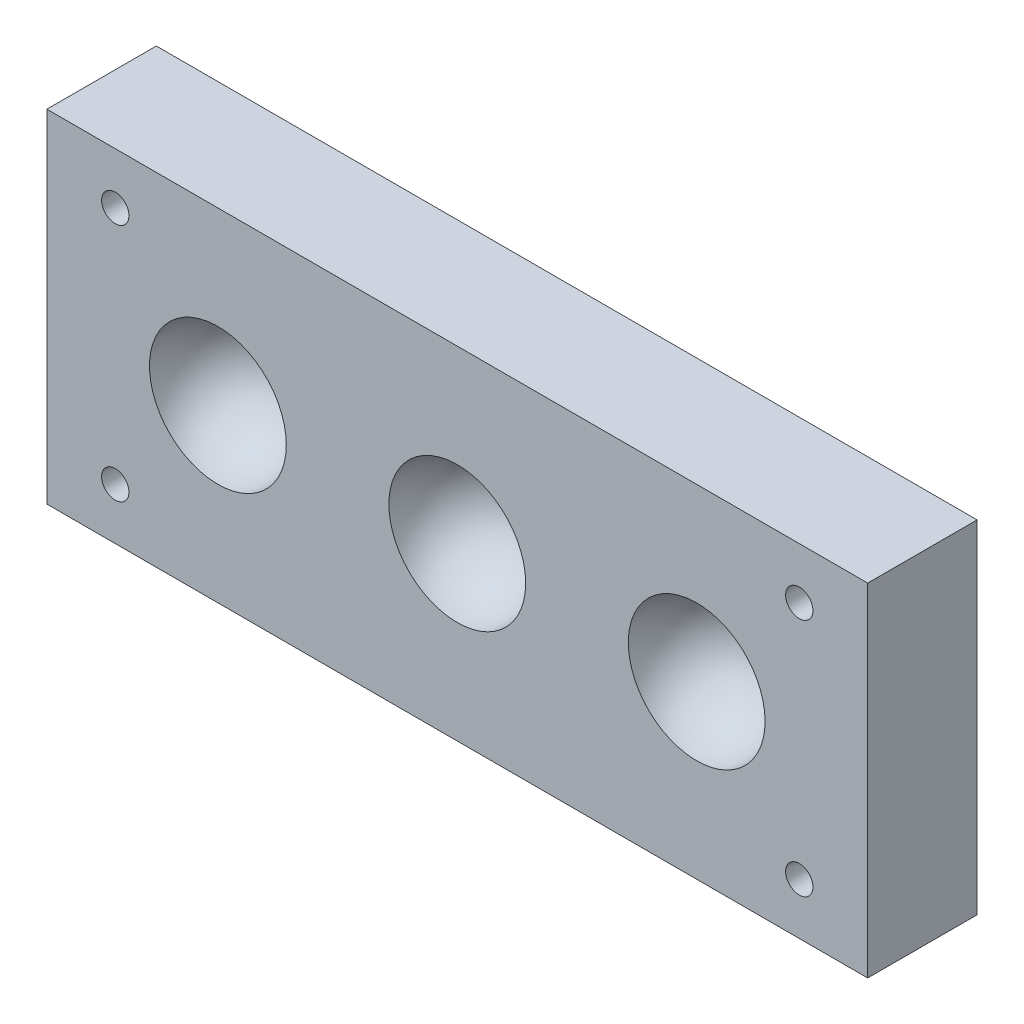
ISO-10303-21;
HEADER;
FILE_DESCRIPTION(('STEP AP214'),'2;1');
FILE_NAME('part.step','',(''),(''),'','','');
FILE_SCHEMA(('AUTOMOTIVE_DESIGN { 1 0 10303 214 1 1 1 1 }'));
ENDSEC;
DATA;
#1=APPLICATION_CONTEXT('core data for automotive mechanical design processes');
#2=APPLICATION_PROTOCOL_DEFINITION('international standard','automotive_design',2000,#1);
#3=PRODUCT_CONTEXT('',#1,'mechanical');
#4=PRODUCT('Part','Part','',(#3));
#5=PRODUCT_RELATED_PRODUCT_CATEGORY('part','',(#4));
#6=PRODUCT_DEFINITION_FORMATION('','',#4);
#7=PRODUCT_DEFINITION_CONTEXT('part definition',#1,'design');
#8=PRODUCT_DEFINITION('design','',#6,#7);
#9=PRODUCT_DEFINITION_SHAPE('','',#8);
#10=(LENGTH_UNIT() NAMED_UNIT(*) SI_UNIT(.MILLI.,.METRE.));
#11=(NAMED_UNIT(*) PLANE_ANGLE_UNIT() SI_UNIT($,.RADIAN.));
#12=(NAMED_UNIT(*) SI_UNIT($,.STERADIAN.) SOLID_ANGLE_UNIT());
#13=UNCERTAINTY_MEASURE_WITH_UNIT(LENGTH_MEASURE(1.E-05),#10,'distance_accuracy_value','');
#14=(GEOMETRIC_REPRESENTATION_CONTEXT(3) GLOBAL_UNCERTAINTY_ASSIGNED_CONTEXT((#13)) GLOBAL_UNIT_ASSIGNED_CONTEXT((#10,
#11,#12)) REPRESENTATION_CONTEXT('',''));
#15=CARTESIAN_POINT('',(0.,0.,0.));
#16=DIRECTION('',(0.,0.,1.));
#17=DIRECTION('',(1.,0.,0.));
#18=AXIS2_PLACEMENT_3D('',#15,#16,#17);
#19=CARTESIAN_POINT('',(35.,0.,0.));
#20=DIRECTION('',(1.,0.,0.));
#21=DIRECTION('',(0.,1.,0.));
#22=AXIS2_PLACEMENT_3D('',#19,#20,#21);
#23=SPHERICAL_SURFACE('',#22,10.);
#24=CARTESIAN_POINT('',(35.,0.,0.));
#25=DIRECTION('',(0.,0.,1.));
#26=DIRECTION('',(1.,0.,0.));
#27=AXIS2_PLACEMENT_3D('',#24,#25,#26);
#28=SPHERICAL_SURFACE('',#27,10.);
#29=CARTESIAN_POINT('',(35.,0.,0.));
#30=DIRECTION('',(0.,0.,1.));
#31=DIRECTION('',(1.,0.,0.));
#32=AXIS2_PLACEMENT_3D('',#29,#30,#31);
#33=CIRCLE('',#32,10.);
#34=CARTESIAN_POINT('',(45.,0.,0.));
#35=VERTEX_POINT('',#34);
#36=EDGE_CURVE('E178',#35,#35,#33,.T.);
#37=ORIENTED_EDGE('',*,*,#36,.T.);
#38=EDGE_LOOP('',(#37));
#39=FACE_BOUND('',#38,.T.);
#40=ADVANCED_FACE('F16',(#39),#28,.F.);
#41=CARTESIAN_POINT('',(0.,0.,0.));
#42=DIRECTION('',(1.,0.,0.));
#43=DIRECTION('',(0.,1.,0.));
#44=AXIS2_PLACEMENT_3D('',#41,#42,#43);
#45=SPHERICAL_SURFACE('',#44,10.);
#46=CARTESIAN_POINT('',(0.,0.,0.));
#47=DIRECTION('',(0.,0.,1.));
#48=DIRECTION('',(1.,0.,0.));
#49=AXIS2_PLACEMENT_3D('',#46,#47,#48);
#50=SPHERICAL_SURFACE('',#49,10.);
#51=CARTESIAN_POINT('',(0.,0.,0.));
#52=DIRECTION('',(0.,0.,1.));
#53=DIRECTION('',(1.,0.,0.));
#54=AXIS2_PLACEMENT_3D('',#51,#52,#53);
#55=CIRCLE('',#54,10.);
#56=CARTESIAN_POINT('',(10.,0.,0.));
#57=VERTEX_POINT('',#56);
#58=EDGE_CURVE('E181',#57,#57,#55,.T.);
#59=ORIENTED_EDGE('',*,*,#58,.T.);
#60=EDGE_LOOP('',(#59));
#61=FACE_BOUND('',#60,.T.);
#62=ADVANCED_FACE('F302',(#61),#50,.F.);
#63=CARTESIAN_POINT('',(-35.,0.,0.));
#64=DIRECTION('',(1.,0.,0.));
#65=DIRECTION('',(0.,1.,0.));
#66=AXIS2_PLACEMENT_3D('',#63,#64,#65);
#67=SPHERICAL_SURFACE('',#66,10.);
#68=CARTESIAN_POINT('',(-35.,0.,0.));
#69=DIRECTION('',(0.,0.,1.));
#70=DIRECTION('',(1.,0.,0.));
#71=AXIS2_PLACEMENT_3D('',#68,#69,#70);
#72=SPHERICAL_SURFACE('',#71,10.);
#73=CARTESIAN_POINT('',(-35.,0.,0.));
#74=DIRECTION('',(0.,0.,1.));
#75=DIRECTION('',(1.,0.,0.));
#76=AXIS2_PLACEMENT_3D('',#73,#74,#75);
#77=CIRCLE('',#76,10.);
#78=CARTESIAN_POINT('',(-25.,0.,0.));
#79=VERTEX_POINT('',#78);
#80=EDGE_CURVE('E184',#79,#79,#77,.T.);
#81=ORIENTED_EDGE('',*,*,#80,.T.);
#82=EDGE_LOOP('',(#81));
#83=FACE_BOUND('',#82,.T.);
#84=ADVANCED_FACE('F287',(#83),#72,.F.);
#85=CARTESIAN_POINT('',(50.,17.5,-38.0953181031254));
#86=DIRECTION('',(0.,0.,1.));
#87=DIRECTION('',(1.,0.,0.));
#88=AXIS2_PLACEMENT_3D('',#85,#86,#87);
#89=CYLINDRICAL_SURFACE('',#88,2.);
#90=CARTESIAN_POINT('',(50.,17.5,-16.));
#91=DIRECTION('',(0.,0.,-1.));
#92=DIRECTION('',(1.,0.,0.));
#93=AXIS2_PLACEMENT_3D('',#90,#91,#92);
#94=CIRCLE('',#93,2.);
#95=CARTESIAN_POINT('',(52.,17.5,-16.));
#96=VERTEX_POINT('',#95);
#97=EDGE_CURVE('E147',#96,#96,#94,.T.);
#98=ORIENTED_EDGE('',*,*,#97,.T.);
#99=EDGE_LOOP('',(#98));
#100=FACE_BOUND('',#99,.T.);
#101=CARTESIAN_POINT('',(50.,17.5,0.));
#102=DIRECTION('',(0.,0.,-1.));
#103=DIRECTION('',(1.,0.,0.));
#104=AXIS2_PLACEMENT_3D('',#101,#102,#103);
#105=CIRCLE('',#104,2.);
#106=CARTESIAN_POINT('',(52.,17.5,0.));
#107=VERTEX_POINT('',#106);
#108=EDGE_CURVE('E187',#107,#107,#105,.T.);
#109=ORIENTED_EDGE('',*,*,#108,.F.);
#110=EDGE_LOOP('',(#109));
#111=FACE_BOUND('',#110,.T.);
#112=ADVANCED_FACE('F283',(#100,#111),#89,.F.);
#113=CARTESIAN_POINT('',(50.,-17.5,-38.0953181031254));
#114=DIRECTION('',(0.,0.,1.));
#115=DIRECTION('',(1.,0.,0.));
#116=AXIS2_PLACEMENT_3D('',#113,#114,#115);
#117=CYLINDRICAL_SURFACE('',#116,2.);
#118=CARTESIAN_POINT('',(50.,-17.5,-16.));
#119=DIRECTION('',(0.,0.,-1.));
#120=DIRECTION('',(1.,0.,0.));
#121=AXIS2_PLACEMENT_3D('',#118,#119,#120);
#122=CIRCLE('',#121,2.);
#123=CARTESIAN_POINT('',(52.,-17.5,-16.));
#124=VERTEX_POINT('',#123);
#125=EDGE_CURVE('E169',#124,#124,#122,.T.);
#126=ORIENTED_EDGE('',*,*,#125,.T.);
#127=EDGE_LOOP('',(#126));
#128=FACE_BOUND('',#127,.T.);
#129=CARTESIAN_POINT('',(50.,-17.5,0.));
#130=DIRECTION('',(0.,0.,-1.));
#131=DIRECTION('',(1.,0.,0.));
#132=AXIS2_PLACEMENT_3D('',#129,#130,#131);
#133=CIRCLE('',#132,2.);
#134=CARTESIAN_POINT('',(52.,-17.5,0.));
#135=VERTEX_POINT('',#134);
#136=EDGE_CURVE('E190',#135,#135,#133,.T.);
#137=ORIENTED_EDGE('',*,*,#136,.F.);
#138=EDGE_LOOP('',(#137));
#139=FACE_BOUND('',#138,.T.);
#140=ADVANCED_FACE('F286',(#128,#139),#117,.F.);
#141=CARTESIAN_POINT('',(-50.,17.5,-38.0953181031254));
#142=DIRECTION('',(0.,0.,1.));
#143=DIRECTION('',(1.,0.,0.));
#144=AXIS2_PLACEMENT_3D('',#141,#142,#143);
#145=CYLINDRICAL_SURFACE('',#144,2.);
#146=CARTESIAN_POINT('',(-50.,17.5,-16.));
#147=DIRECTION('',(0.,0.,-1.));
#148=DIRECTION('',(1.,0.,0.));
#149=AXIS2_PLACEMENT_3D('',#146,#147,#148);
#150=CIRCLE('',#149,2.);
#151=CARTESIAN_POINT('',(-48.,17.5,-16.));
#152=VERTEX_POINT('',#151);
#153=EDGE_CURVE('E172',#152,#152,#150,.T.);
#154=ORIENTED_EDGE('',*,*,#153,.T.);
#155=EDGE_LOOP('',(#154));
#156=FACE_BOUND('',#155,.T.);
#157=CARTESIAN_POINT('',(-50.,17.5,0.));
#158=DIRECTION('',(0.,0.,-1.));
#159=DIRECTION('',(1.,0.,0.));
#160=AXIS2_PLACEMENT_3D('',#157,#158,#159);
#161=CIRCLE('',#160,2.);
#162=CARTESIAN_POINT('',(-48.,17.5,0.));
#163=VERTEX_POINT('',#162);
#164=EDGE_CURVE('E24',#163,#163,#161,.T.);
#165=ORIENTED_EDGE('',*,*,#164,.F.);
#166=EDGE_LOOP('',(#165));
#167=FACE_BOUND('',#166,.T.);
#168=ADVANCED_FACE('F319',(#156,#167),#145,.F.);
#169=CARTESIAN_POINT('',(-50.,-17.5,-38.0953181031254));
#170=DIRECTION('',(0.,0.,1.));
#171=DIRECTION('',(1.,0.,0.));
#172=AXIS2_PLACEMENT_3D('',#169,#170,#171);
#173=CYLINDRICAL_SURFACE('',#172,2.);
#174=CARTESIAN_POINT('',(-50.,-17.5,-16.));
#175=DIRECTION('',(0.,0.,-1.));
#176=DIRECTION('',(1.,0.,0.));
#177=AXIS2_PLACEMENT_3D('',#174,#175,#176);
#178=CIRCLE('',#177,2.);
#179=CARTESIAN_POINT('',(-48.,-17.5,-16.));
#180=VERTEX_POINT('',#179);
#181=EDGE_CURVE('E175',#180,#180,#178,.T.);
#182=ORIENTED_EDGE('',*,*,#181,.T.);
#183=EDGE_LOOP('',(#182));
#184=FACE_BOUND('',#183,.T.);
#185=CARTESIAN_POINT('',(-50.,-17.5,0.));
#186=DIRECTION('',(0.,0.,-1.));
#187=DIRECTION('',(1.,0.,0.));
#188=AXIS2_PLACEMENT_3D('',#185,#186,#187);
#189=CIRCLE('',#188,2.);
#190=CARTESIAN_POINT('',(-48.,-17.5,0.));
#191=VERTEX_POINT('',#190);
#192=EDGE_CURVE('E10',#191,#191,#189,.T.);
#193=ORIENTED_EDGE('',*,*,#192,.F.);
#194=EDGE_LOOP('',(#193));
#195=FACE_BOUND('',#194,.T.);
#196=ADVANCED_FACE('F293',(#184,#195),#173,.F.);
#197=CARTESIAN_POINT('',(0.,0.,0.));
#198=DIRECTION('',(0.,0.,1.));
#199=DIRECTION('',(1.,0.,0.));
#200=AXIS2_PLACEMENT_3D('',#197,#198,#199);
#201=PLANE('',#200);
#202=DIRECTION('',(1.,0.,0.));
#203=VECTOR('',#202,1.);
#204=CARTESIAN_POINT('',(-60.,-25.,0.));
#205=LINE('',#204,#203);
#206=CARTESIAN_POINT('',(-60.,-25.,0.));
#207=VERTEX_POINT('',#206);
#208=CARTESIAN_POINT('',(60.,-25.,0.));
#209=VERTEX_POINT('',#208);
#210=EDGE_CURVE('E115',#207,#209,#205,.T.);
#211=ORIENTED_EDGE('',*,*,#210,.T.);
#212=DIRECTION('',(0.,1.,0.));
#213=VECTOR('',#212,1.);
#214=CARTESIAN_POINT('',(60.,-25.,0.));
#215=LINE('',#214,#213);
#216=CARTESIAN_POINT('',(60.,25.,0.));
#217=VERTEX_POINT('',#216);
#218=EDGE_CURVE('E155',#209,#217,#215,.T.);
#219=ORIENTED_EDGE('',*,*,#218,.T.);
#220=DIRECTION('',(-1.,0.,0.));
#221=VECTOR('',#220,1.);
#222=CARTESIAN_POINT('',(60.,25.,0.));
#223=LINE('',#222,#221);
#224=CARTESIAN_POINT('',(-60.,25.,0.));
#225=VERTEX_POINT('',#224);
#226=EDGE_CURVE('E116',#217,#225,#223,.T.);
#227=ORIENTED_EDGE('',*,*,#226,.T.);
#228=DIRECTION('',(0.,-1.,0.));
#229=VECTOR('',#228,1.);
#230=CARTESIAN_POINT('',(-60.,25.,0.));
#231=LINE('',#230,#229);
#232=EDGE_CURVE('E110',#225,#207,#231,.T.);
#233=ORIENTED_EDGE('',*,*,#232,.T.);
#234=EDGE_LOOP('',(#211,#219,#227,#233));
#235=FACE_BOUND('',#234,.T.);
#236=ORIENTED_EDGE('',*,*,#192,.T.);
#237=EDGE_LOOP('',(#236));
#238=FACE_BOUND('',#237,.T.);
#239=ORIENTED_EDGE('',*,*,#164,.T.);
#240=EDGE_LOOP('',(#239));
#241=FACE_BOUND('',#240,.T.);
#242=ORIENTED_EDGE('',*,*,#136,.T.);
#243=EDGE_LOOP('',(#242));
#244=FACE_BOUND('',#243,.T.);
#245=ORIENTED_EDGE('',*,*,#108,.T.);
#246=EDGE_LOOP('',(#245));
#247=FACE_BOUND('',#246,.T.);
#248=ORIENTED_EDGE('',*,*,#80,.F.);
#249=EDGE_LOOP('',(#248));
#250=FACE_BOUND('',#249,.T.);
#251=ORIENTED_EDGE('',*,*,#58,.F.);
#252=EDGE_LOOP('',(#251));
#253=FACE_BOUND('',#252,.T.);
#254=ORIENTED_EDGE('',*,*,#36,.F.);
#255=EDGE_LOOP('',(#254));
#256=FACE_BOUND('',#255,.T.);
#257=ADVANCED_FACE('F112',(#235,#238,#241,#244,#247,#250,#253,#256),#201,.T.);
#258=CARTESIAN_POINT('',(0.,0.,-16.));
#259=DIRECTION('',(0.,0.,1.));
#260=DIRECTION('',(1.,0.,0.));
#261=AXIS2_PLACEMENT_3D('',#258,#259,#260);
#262=PLANE('',#261);
#263=DIRECTION('',(1.,0.,0.));
#264=VECTOR('',#263,1.);
#265=CARTESIAN_POINT('',(-60.,-25.,-16.));
#266=LINE('',#265,#264);
#267=CARTESIAN_POINT('',(-60.,-25.,-16.));
#268=VERTEX_POINT('',#267);
#269=CARTESIAN_POINT('',(60.,-25.,-16.));
#270=VERTEX_POINT('',#269);
#271=EDGE_CURVE('E131',#268,#270,#266,.T.);
#272=ORIENTED_EDGE('',*,*,#271,.F.);
#273=DIRECTION('',(0.,-1.,0.));
#274=VECTOR('',#273,1.);
#275=CARTESIAN_POINT('',(-60.,25.,-16.));
#276=LINE('',#275,#274);
#277=CARTESIAN_POINT('',(-60.,25.,-16.));
#278=VERTEX_POINT('',#277);
#279=EDGE_CURVE('E121',#278,#268,#276,.T.);
#280=ORIENTED_EDGE('',*,*,#279,.F.);
#281=DIRECTION('',(-1.,0.,0.));
#282=VECTOR('',#281,1.);
#283=CARTESIAN_POINT('',(60.,25.,-16.));
#284=LINE('',#283,#282);
#285=CARTESIAN_POINT('',(60.,25.,-16.));
#286=VERTEX_POINT('',#285);
#287=EDGE_CURVE('E150',#286,#278,#284,.T.);
#288=ORIENTED_EDGE('',*,*,#287,.F.);
#289=DIRECTION('',(0.,1.,0.));
#290=VECTOR('',#289,1.);
#291=CARTESIAN_POINT('',(60.,-25.,-16.));
#292=LINE('',#291,#290);
#293=EDGE_CURVE('E160',#270,#286,#292,.T.);
#294=ORIENTED_EDGE('',*,*,#293,.F.);
#295=EDGE_LOOP('',(#272,#280,#288,#294));
#296=FACE_BOUND('',#295,.T.);
#297=ORIENTED_EDGE('',*,*,#181,.F.);
#298=EDGE_LOOP('',(#297));
#299=FACE_BOUND('',#298,.T.);
#300=ORIENTED_EDGE('',*,*,#153,.F.);
#301=EDGE_LOOP('',(#300));
#302=FACE_BOUND('',#301,.T.);
#303=ORIENTED_EDGE('',*,*,#125,.F.);
#304=EDGE_LOOP('',(#303));
#305=FACE_BOUND('',#304,.T.);
#306=ORIENTED_EDGE('',*,*,#97,.F.);
#307=EDGE_LOOP('',(#306));
#308=FACE_BOUND('',#307,.T.);
#309=ADVANCED_FACE('F271',(#296,#299,#302,#305,#308),#262,.F.);
#310=CARTESIAN_POINT('',(-60.,25.,-16.));
#311=DIRECTION('',(-1.,0.,0.));
#312=DIRECTION('',(0.,0.,1.));
#313=AXIS2_PLACEMENT_3D('',#310,#311,#312);
#314=PLANE('',#313);
#315=ORIENTED_EDGE('',*,*,#232,.F.);
#316=DIRECTION('',(0.,0.,1.));
#317=VECTOR('',#316,1.);
#318=CARTESIAN_POINT('',(-60.,25.,-16.));
#319=LINE('',#318,#317);
#320=EDGE_CURVE('E122',#278,#225,#319,.T.);
#321=ORIENTED_EDGE('',*,*,#320,.F.);
#322=ORIENTED_EDGE('',*,*,#279,.T.);
#323=DIRECTION('',(0.,0.,1.));
#324=VECTOR('',#323,1.);
#325=CARTESIAN_POINT('',(-60.,-25.,-16.));
#326=LINE('',#325,#324);
#327=EDGE_CURVE('E125',#268,#207,#326,.T.);
#328=ORIENTED_EDGE('',*,*,#327,.T.);
#329=EDGE_LOOP('',(#315,#321,#322,#328));
#330=FACE_BOUND('',#329,.T.);
#331=ADVANCED_FACE('F126',(#330),#314,.T.);
#332=CARTESIAN_POINT('',(60.,25.,-16.));
#333=DIRECTION('',(0.,1.,0.));
#334=DIRECTION('',(1.,0.,0.));
#335=AXIS2_PLACEMENT_3D('',#332,#333,#334);
#336=PLANE('',#335);
#337=ORIENTED_EDGE('',*,*,#226,.F.);
#338=DIRECTION('',(0.,0.,1.));
#339=VECTOR('',#338,1.);
#340=CARTESIAN_POINT('',(60.,25.,-16.));
#341=LINE('',#340,#339);
#342=EDGE_CURVE('E143',#286,#217,#341,.T.);
#343=ORIENTED_EDGE('',*,*,#342,.F.);
#344=ORIENTED_EDGE('',*,*,#287,.T.);
#345=ORIENTED_EDGE('',*,*,#320,.T.);
#346=EDGE_LOOP('',(#337,#343,#344,#345));
#347=FACE_BOUND('',#346,.T.);
#348=ADVANCED_FACE('F269',(#347),#336,.T.);
#349=CARTESIAN_POINT('',(60.,-25.,-16.));
#350=DIRECTION('',(1.,0.,0.));
#351=DIRECTION('',(0.,1.,0.));
#352=AXIS2_PLACEMENT_3D('',#349,#350,#351);
#353=PLANE('',#352);
#354=ORIENTED_EDGE('',*,*,#218,.F.);
#355=DIRECTION('',(0.,0.,1.));
#356=VECTOR('',#355,1.);
#357=CARTESIAN_POINT('',(60.,-25.,-16.));
#358=LINE('',#357,#356);
#359=EDGE_CURVE('E136',#270,#209,#358,.T.);
#360=ORIENTED_EDGE('',*,*,#359,.F.);
#361=ORIENTED_EDGE('',*,*,#293,.T.);
#362=ORIENTED_EDGE('',*,*,#342,.T.);
#363=EDGE_LOOP('',(#354,#360,#361,#362));
#364=FACE_BOUND('',#363,.T.);
#365=ADVANCED_FACE('F267',(#364),#353,.T.);
#366=CARTESIAN_POINT('',(-60.,-25.,-16.));
#367=DIRECTION('',(0.,-1.,0.));
#368=DIRECTION('',(0.,0.,-1.));
#369=AXIS2_PLACEMENT_3D('',#366,#367,#368);
#370=PLANE('',#369);
#371=ORIENTED_EDGE('',*,*,#210,.F.);
#372=ORIENTED_EDGE('',*,*,#327,.F.);
#373=ORIENTED_EDGE('',*,*,#271,.T.);
#374=ORIENTED_EDGE('',*,*,#359,.T.);
#375=EDGE_LOOP('',(#371,#372,#373,#374));
#376=FACE_BOUND('',#375,.T.);
#377=ADVANCED_FACE('F134',(#376),#370,.T.);
#378=CLOSED_SHELL('',(#40,#62,#84,#112,#140,#168,#196,#257,#309,#331,#348,#365,#377));
#379=MANIFOLD_SOLID_BREP('B1',#378);
#380=ADVANCED_BREP_SHAPE_REPRESENTATION('',(#18,#379),#14);
#381=SHAPE_DEFINITION_REPRESENTATION(#9,#380);
ENDSEC;
END-ISO-10303-21;
